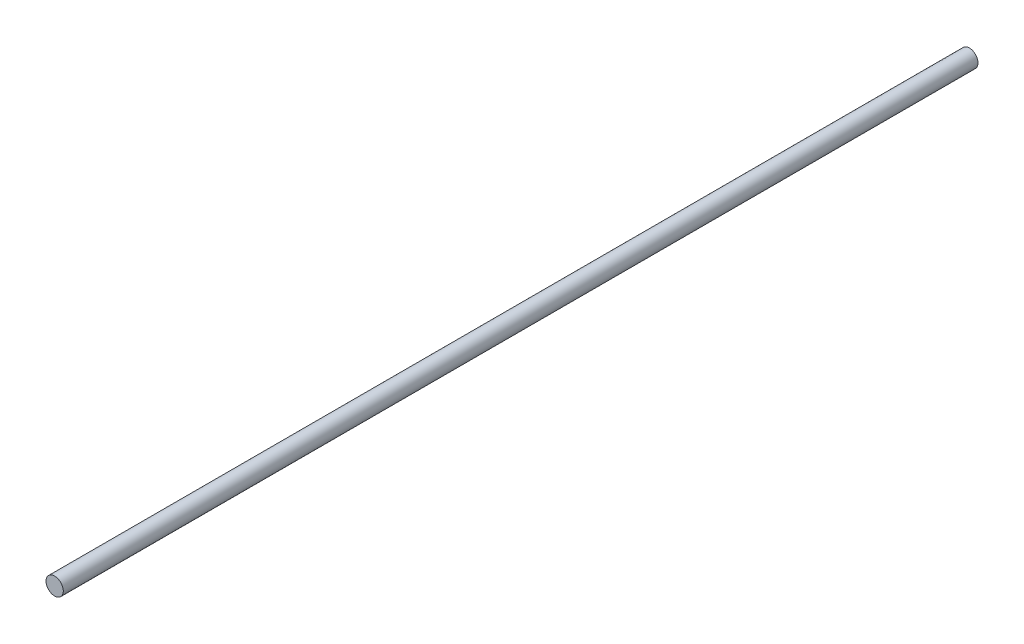
ISO-10303-21;
HEADER;
FILE_DESCRIPTION(('STEP AP214'),'2;1');
FILE_NAME('part.step','',(''),(''),'','','');
FILE_SCHEMA(('AUTOMOTIVE_DESIGN { 1 0 10303 214 1 1 1 1 }'));
ENDSEC;
DATA;
#1=APPLICATION_CONTEXT('core data for automotive mechanical design processes');
#2=APPLICATION_PROTOCOL_DEFINITION('international standard','automotive_design',2000,#1);
#3=PRODUCT_CONTEXT('',#1,'mechanical');
#4=PRODUCT('Part','Part','',(#3));
#5=PRODUCT_RELATED_PRODUCT_CATEGORY('part','',(#4));
#6=PRODUCT_DEFINITION_FORMATION('','',#4);
#7=PRODUCT_DEFINITION_CONTEXT('part definition',#1,'design');
#8=PRODUCT_DEFINITION('design','',#6,#7);
#9=PRODUCT_DEFINITION_SHAPE('','',#8);
#10=(LENGTH_UNIT() NAMED_UNIT(*) SI_UNIT(.MILLI.,.METRE.));
#11=(NAMED_UNIT(*) PLANE_ANGLE_UNIT() SI_UNIT($,.RADIAN.));
#12=(NAMED_UNIT(*) SI_UNIT($,.STERADIAN.) SOLID_ANGLE_UNIT());
#13=UNCERTAINTY_MEASURE_WITH_UNIT(LENGTH_MEASURE(1.E-05),#10,'distance_accuracy_value','');
#14=(GEOMETRIC_REPRESENTATION_CONTEXT(3) GLOBAL_UNCERTAINTY_ASSIGNED_CONTEXT((#13)) GLOBAL_UNIT_ASSIGNED_CONTEXT((#10,
#11,#12)) REPRESENTATION_CONTEXT('',''));
#15=CARTESIAN_POINT('',(0.,0.,0.));
#16=DIRECTION('',(0.,0.,1.));
#17=DIRECTION('',(1.,0.,0.));
#18=AXIS2_PLACEMENT_3D('',#15,#16,#17);
#19=CARTESIAN_POINT('',(0.,0.,10.));
#20=DIRECTION('',(0.,0.,1.));
#21=DIRECTION('',(1.,0.,0.));
#22=AXIS2_PLACEMENT_3D('',#19,#20,#21);
#23=PLANE('',#22);
#24=CARTESIAN_POINT('',(0.,0.,10.));
#25=DIRECTION('',(0.,0.,1.));
#26=DIRECTION('',(1.,0.,0.));
#27=AXIS2_PLACEMENT_3D('',#24,#25,#26);
#28=CIRCLE('',#27,60.);
#29=CARTESIAN_POINT('',(-60.,0.,10.0000000000007));
#30=VERTEX_POINT('',#29);
#31=EDGE_CURVE('E37',#30,#30,#28,.T.);
#32=ORIENTED_EDGE('',*,*,#31,.F.);
#33=EDGE_LOOP('',(#32));
#34=FACE_BOUND('',#33,.T.);
#35=ADVANCED_FACE('F33',(#34),#23,.F.);
#36=CARTESIAN_POINT('',(0.,0.,6360.));
#37=DIRECTION('',(0.,0.,1.));
#38=DIRECTION('',(1.,0.,0.));
#39=AXIS2_PLACEMENT_3D('',#36,#37,#38);
#40=PLANE('',#39);
#41=CARTESIAN_POINT('',(0.,0.,6360.));
#42=DIRECTION('',(0.,0.,1.));
#43=DIRECTION('',(1.,0.,0.));
#44=AXIS2_PLACEMENT_3D('',#41,#42,#43);
#45=CIRCLE('',#44,60.);
#46=CARTESIAN_POINT('',(-60.,0.,6360.));
#47=VERTEX_POINT('',#46);
#48=EDGE_CURVE('E10',#47,#47,#45,.T.);
#49=ORIENTED_EDGE('',*,*,#48,.T.);
#50=EDGE_LOOP('',(#49));
#51=FACE_BOUND('',#50,.T.);
#52=ADVANCED_FACE('F48',(#51),#40,.T.);
#53=CARTESIAN_POINT('',(0.,0.,6360.));
#54=DIRECTION('',(0.,0.,-1.));
#55=DIRECTION('',(-1.,0.,0.));
#56=AXIS2_PLACEMENT_3D('',#53,#54,#55);
#57=CYLINDRICAL_SURFACE('',#56,60.);
#58=CARTESIAN_POINT('',(-60.,0.,6360.));
#59=CARTESIAN_POINT('',(-60.,0.,6293.85416666667));
#60=CARTESIAN_POINT('',(-60.,0.,6227.70833333333));
#61=CARTESIAN_POINT('',(-60.,0.,6095.41666666667));
#62=CARTESIAN_POINT('',(-60.,0.,6029.27083333333));
#63=CARTESIAN_POINT('',(-60.,0.,5896.97916666667));
#64=CARTESIAN_POINT('',(-60.,0.,5830.83333333333));
#65=CARTESIAN_POINT('',(-60.,0.,5698.54166666667));
#66=CARTESIAN_POINT('',(-60.,0.,5632.39583333333));
#67=CARTESIAN_POINT('',(-60.,0.,5500.10416666667));
#68=CARTESIAN_POINT('',(-60.,0.,5433.95833333333));
#69=CARTESIAN_POINT('',(-60.,0.,5301.66666666667));
#70=CARTESIAN_POINT('',(-60.,0.,5235.52083333333));
#71=CARTESIAN_POINT('',(-60.,0.,5103.22916666667));
#72=CARTESIAN_POINT('',(-60.,0.,5037.08333333333));
#73=CARTESIAN_POINT('',(-60.,0.,4904.79166666667));
#74=CARTESIAN_POINT('',(-60.,0.,4838.64583333333));
#75=CARTESIAN_POINT('',(-60.,0.,4706.35416666667));
#76=CARTESIAN_POINT('',(-60.,0.,4640.20833333333));
#77=CARTESIAN_POINT('',(-60.,0.,4507.91666666667));
#78=CARTESIAN_POINT('',(-60.,0.,4441.77083333333));
#79=CARTESIAN_POINT('',(-60.,0.,4309.47916666667));
#80=CARTESIAN_POINT('',(-60.,0.,4243.33333333333));
#81=CARTESIAN_POINT('',(-60.,0.,4111.04166666667));
#82=CARTESIAN_POINT('',(-60.,0.,4044.89583333333));
#83=CARTESIAN_POINT('',(-60.,0.,3912.60416666667));
#84=CARTESIAN_POINT('',(-60.,0.,3846.45833333333));
#85=CARTESIAN_POINT('',(-60.,0.,3714.16666666667));
#86=CARTESIAN_POINT('',(-60.,0.,3648.02083333333));
#87=CARTESIAN_POINT('',(-60.,0.,3515.72916666667));
#88=CARTESIAN_POINT('',(-60.,0.,3449.58333333333));
#89=CARTESIAN_POINT('',(-60.,0.,3317.29166666667));
#90=CARTESIAN_POINT('',(-60.,0.,3251.14583333333));
#91=CARTESIAN_POINT('',(-60.,0.,3118.85416666667));
#92=CARTESIAN_POINT('',(-60.,0.,3052.70833333333));
#93=CARTESIAN_POINT('',(-60.,0.,2920.41666666667));
#94=CARTESIAN_POINT('',(-60.,0.,2854.27083333333));
#95=CARTESIAN_POINT('',(-60.,0.,2721.97916666667));
#96=CARTESIAN_POINT('',(-60.,0.,2655.83333333333));
#97=CARTESIAN_POINT('',(-60.,0.,2523.54166666667));
#98=CARTESIAN_POINT('',(-60.,0.,2457.39583333333));
#99=CARTESIAN_POINT('',(-60.,0.,2325.10416666667));
#100=CARTESIAN_POINT('',(-60.,0.,2258.95833333333));
#101=CARTESIAN_POINT('',(-60.,0.,2126.66666666667));
#102=CARTESIAN_POINT('',(-60.,0.,2060.52083333333));
#103=CARTESIAN_POINT('',(-60.,0.,1928.22916666667));
#104=CARTESIAN_POINT('',(-60.,0.,1862.08333333333));
#105=CARTESIAN_POINT('',(-60.,0.,1729.79166666667));
#106=CARTESIAN_POINT('',(-60.,0.,1663.64583333333));
#107=CARTESIAN_POINT('',(-60.,0.,1531.35416666667));
#108=CARTESIAN_POINT('',(-60.,0.,1465.20833333333));
#109=CARTESIAN_POINT('',(-60.,0.,1332.91666666667));
#110=CARTESIAN_POINT('',(-60.,0.,1266.77083333333));
#111=CARTESIAN_POINT('',(-60.,0.,1134.47916666667));
#112=CARTESIAN_POINT('',(-60.,0.,1068.33333333333));
#113=CARTESIAN_POINT('',(-60.,0.,936.041666666667));
#114=CARTESIAN_POINT('',(-60.,0.,869.895833333334));
#115=CARTESIAN_POINT('',(-60.,0.,737.604166666668));
#116=CARTESIAN_POINT('',(-60.,0.,671.458333333334));
#117=CARTESIAN_POINT('',(-60.,0.,539.166666666667));
#118=CARTESIAN_POINT('',(-60.,0.,473.020833333334));
#119=CARTESIAN_POINT('',(-60.,0.,340.729166666667));
#120=CARTESIAN_POINT('',(-60.,0.,274.583333333334));
#121=CARTESIAN_POINT('',(-60.,0.,142.291666666667));
#122=CARTESIAN_POINT('',(-60.,0.,76.145833333334));
#123=CARTESIAN_POINT('',(-60.,0.,10.0000000000007));
#124=B_SPLINE_CURVE_WITH_KNOTS('',3,(#58,#59,#60,#61,#62,#63,#64,#65,#66,#67,#68,#69,#70,#71,
#72,#73,#74,#75,#76,#77,#78,#79,#80,#81,#82,#83,#84,#85,#86,#87,#88,#89,#90,#91,#92,#93,#94,#95,
#96,#97,#98,#99,#100,#101,#102,#103,#104,#105,#106,#107,#108,#109,#110,#111,#112,#113,#114,#115,
#116,#117,#118,#119,#120,#121,#122,#123),.UNSPECIFIED.,.F.,.F.,(4,2,2,2,2,2,2,2,2,2,2,2,2,2,2,2,
2,2,2,2,2,2,2,2,2,2,2,2,2,2,2,2,4),(0.,198.437500000001,396.875000000001,595.3125,793.75,
992.1875,1190.625,1389.0625,1587.5,1785.9375,1984.375,2182.8125,2381.25,2579.6875,2778.125,
2976.5625,3175.,3373.4375,3571.875,3770.3125,3968.75,4167.1875,4365.625,4564.0625,4762.5,
4960.9375,5159.375,5357.8125,5556.25,5754.6875,5953.125,6151.5625,6350.),.UNSPECIFIED.);
#125=EDGE_CURVE('BSEAM35',#47,#30,#124,.T.);
#126=ORIENTED_EDGE('',*,*,#48,.F.);
#127=ORIENTED_EDGE('',*,*,#31,.T.);
#128=ORIENTED_EDGE('',*,*,#125,.T.);
#129=ORIENTED_EDGE('',*,*,#125,.F.);
#130=EDGE_LOOP('',(#126,#128,#127,#129));
#131=FACE_BOUND('',#130,.T.);
#132=ADVANCED_FACE('F35',(#131),#57,.T.);
#133=CLOSED_SHELL('',(#35,#52,#132));
#134=MANIFOLD_SOLID_BREP('B2',#133);
#135=ADVANCED_BREP_SHAPE_REPRESENTATION('',(#18,#134),#14);
#136=SHAPE_DEFINITION_REPRESENTATION(#9,#135);
ENDSEC;
END-ISO-10303-21;
